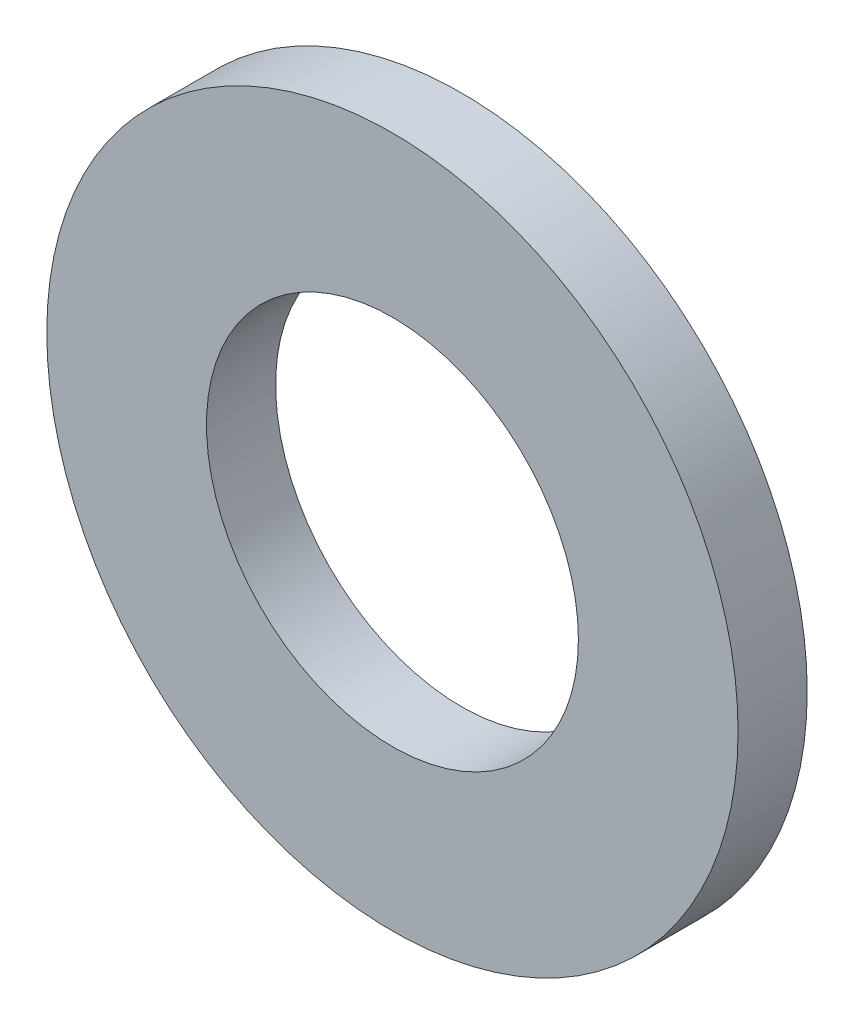
ISO-10303-21;
HEADER;
FILE_DESCRIPTION(('STEP AP214'),'2;1');
FILE_NAME('part.step','',(''),(''),'','','');
FILE_SCHEMA(('AUTOMOTIVE_DESIGN { 1 0 10303 214 1 1 1 1 }'));
ENDSEC;
DATA;
#1=APPLICATION_CONTEXT('core data for automotive mechanical design processes');
#2=APPLICATION_PROTOCOL_DEFINITION('international standard','automotive_design',2000,#1);
#3=PRODUCT_CONTEXT('',#1,'mechanical');
#4=PRODUCT('Part','Part','',(#3));
#5=PRODUCT_RELATED_PRODUCT_CATEGORY('part','',(#4));
#6=PRODUCT_DEFINITION_FORMATION('','',#4);
#7=PRODUCT_DEFINITION_CONTEXT('part definition',#1,'design');
#8=PRODUCT_DEFINITION('design','',#6,#7);
#9=PRODUCT_DEFINITION_SHAPE('','',#8);
#10=(LENGTH_UNIT() NAMED_UNIT(*) SI_UNIT(.MILLI.,.METRE.));
#11=(NAMED_UNIT(*) PLANE_ANGLE_UNIT() SI_UNIT($,.RADIAN.));
#12=(NAMED_UNIT(*) SI_UNIT($,.STERADIAN.) SOLID_ANGLE_UNIT());
#13=UNCERTAINTY_MEASURE_WITH_UNIT(LENGTH_MEASURE(1.E-05),#10,'distance_accuracy_value','');
#14=(GEOMETRIC_REPRESENTATION_CONTEXT(3) GLOBAL_UNCERTAINTY_ASSIGNED_CONTEXT((#13)) GLOBAL_UNIT_ASSIGNED_CONTEXT((#10,
#11,#12)) REPRESENTATION_CONTEXT('',''));
#15=CARTESIAN_POINT('',(0.,0.,0.));
#16=DIRECTION('',(0.,0.,1.));
#17=DIRECTION('',(1.,0.,0.));
#18=AXIS2_PLACEMENT_3D('',#15,#16,#17);
#19=CARTESIAN_POINT('',(0.,0.,-0.5));
#20=DIRECTION('',(0.,0.,1.));
#21=DIRECTION('',(1.,0.,0.));
#22=AXIS2_PLACEMENT_3D('',#19,#20,#21);
#23=CYLINDRICAL_SURFACE('',#22,2.5);
#24=CARTESIAN_POINT('',(0.,0.,-0.5));
#25=DIRECTION('',(0.,0.,1.));
#26=DIRECTION('',(1.,0.,0.));
#27=AXIS2_PLACEMENT_3D('',#24,#25,#26);
#28=CIRCLE('',#27,2.5);
#29=CARTESIAN_POINT('',(2.5,0.,-0.5));
#30=VERTEX_POINT('',#29);
#31=EDGE_CURVE('E11',#30,#30,#28,.T.);
#32=ORIENTED_EDGE('',*,*,#31,.T.);
#33=EDGE_LOOP('',(#32));
#34=FACE_BOUND('',#33,.T.);
#35=CARTESIAN_POINT('',(0.,0.,0.));
#36=DIRECTION('',(0.,0.,1.));
#37=DIRECTION('',(1.,0.,0.));
#38=AXIS2_PLACEMENT_3D('',#35,#36,#37);
#39=CIRCLE('',#38,2.5);
#40=CARTESIAN_POINT('',(2.5,0.,0.));
#41=VERTEX_POINT('',#40);
#42=EDGE_CURVE('E42',#41,#41,#39,.T.);
#43=ORIENTED_EDGE('',*,*,#42,.F.);
#44=EDGE_LOOP('',(#43));
#45=FACE_BOUND('',#44,.T.);
#46=ADVANCED_FACE('F39',(#34,#45),#23,.T.);
#47=CARTESIAN_POINT('',(0.,0.,-0.5));
#48=DIRECTION('',(0.,0.,1.));
#49=DIRECTION('',(1.,0.,0.));
#50=AXIS2_PLACEMENT_3D('',#47,#48,#49);
#51=PLANE('',#50);
#52=CARTESIAN_POINT('',(0.,0.,-0.5));
#53=DIRECTION('',(0.,0.,1.));
#54=DIRECTION('',(1.,0.,0.));
#55=AXIS2_PLACEMENT_3D('',#52,#53,#54);
#56=CIRCLE('',#55,1.345);
#57=CARTESIAN_POINT('',(1.345,0.,-0.5));
#58=VERTEX_POINT('',#57);
#59=EDGE_CURVE('E49',#58,#58,#56,.T.);
#60=ORIENTED_EDGE('',*,*,#59,.T.);
#61=EDGE_LOOP('',(#60));
#62=FACE_BOUND('',#61,.T.);
#63=ORIENTED_EDGE('',*,*,#31,.F.);
#64=EDGE_LOOP('',(#63));
#65=FACE_BOUND('',#64,.T.);
#66=ADVANCED_FACE('F57',(#62,#65),#51,.F.);
#67=CARTESIAN_POINT('',(0.,0.,0.));
#68=DIRECTION('',(0.,0.,1.));
#69=DIRECTION('',(1.,0.,0.));
#70=AXIS2_PLACEMENT_3D('',#67,#68,#69);
#71=PLANE('',#70);
#72=CARTESIAN_POINT('',(0.,0.,0.));
#73=DIRECTION('',(0.,0.,1.));
#74=DIRECTION('',(1.,0.,0.));
#75=AXIS2_PLACEMENT_3D('',#72,#73,#74);
#76=CIRCLE('',#75,1.345);
#77=CARTESIAN_POINT('',(1.345,0.,0.));
#78=VERTEX_POINT('',#77);
#79=EDGE_CURVE('E51',#78,#78,#76,.T.);
#80=ORIENTED_EDGE('',*,*,#79,.F.);
#81=EDGE_LOOP('',(#80));
#82=FACE_BOUND('',#81,.T.);
#83=ORIENTED_EDGE('',*,*,#42,.T.);
#84=EDGE_LOOP('',(#83));
#85=FACE_BOUND('',#84,.T.);
#86=ADVANCED_FACE('F63',(#82,#85),#71,.T.);
#87=CARTESIAN_POINT('',(0.,0.,-0.5));
#88=DIRECTION('',(0.,0.,1.));
#89=DIRECTION('',(1.,0.,0.));
#90=AXIS2_PLACEMENT_3D('',#87,#88,#89);
#91=CYLINDRICAL_SURFACE('',#90,1.345);
#92=ORIENTED_EDGE('',*,*,#59,.F.);
#93=EDGE_LOOP('',(#92));
#94=FACE_BOUND('',#93,.T.);
#95=ORIENTED_EDGE('',*,*,#79,.T.);
#96=EDGE_LOOP('',(#95));
#97=FACE_BOUND('',#96,.T.);
#98=ADVANCED_FACE('F60',(#94,#97),#91,.F.);
#99=CLOSED_SHELL('',(#46,#66,#86,#98));
#100=MANIFOLD_SOLID_BREP('B2',#99);
#101=ADVANCED_BREP_SHAPE_REPRESENTATION('',(#18,#100),#14);
#102=SHAPE_DEFINITION_REPRESENTATION(#9,#101);
ENDSEC;
END-ISO-10303-21;
